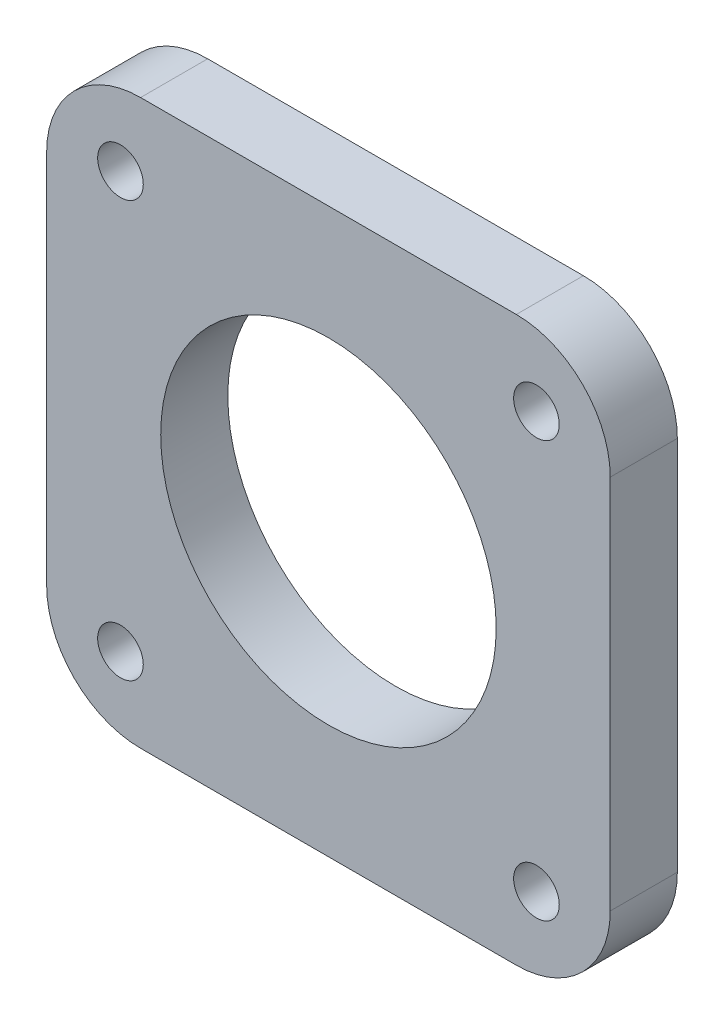
ISO-10303-21;
HEADER;
FILE_DESCRIPTION(('STEP AP214'),'2;1');
FILE_NAME('part.step','',(''),(''),'','','');
FILE_SCHEMA(('AUTOMOTIVE_DESIGN { 1 0 10303 214 1 1 1 1 }'));
ENDSEC;
DATA;
#1=APPLICATION_CONTEXT('core data for automotive mechanical design processes');
#2=APPLICATION_PROTOCOL_DEFINITION('international standard','automotive_design',2000,#1);
#3=PRODUCT_CONTEXT('',#1,'mechanical');
#4=PRODUCT('Part','Part','',(#3));
#5=PRODUCT_RELATED_PRODUCT_CATEGORY('part','',(#4));
#6=PRODUCT_DEFINITION_FORMATION('','',#4);
#7=PRODUCT_DEFINITION_CONTEXT('part definition',#1,'design');
#8=PRODUCT_DEFINITION('design','',#6,#7);
#9=PRODUCT_DEFINITION_SHAPE('','',#8);
#10=(LENGTH_UNIT() NAMED_UNIT(*) SI_UNIT(.MILLI.,.METRE.));
#11=(NAMED_UNIT(*) PLANE_ANGLE_UNIT() SI_UNIT($,.RADIAN.));
#12=(NAMED_UNIT(*) SI_UNIT($,.STERADIAN.) SOLID_ANGLE_UNIT());
#13=UNCERTAINTY_MEASURE_WITH_UNIT(LENGTH_MEASURE(1.E-05),#10,'distance_accuracy_value','');
#14=(GEOMETRIC_REPRESENTATION_CONTEXT(3) GLOBAL_UNCERTAINTY_ASSIGNED_CONTEXT((#13)) GLOBAL_UNIT_ASSIGNED_CONTEXT((#10,
#11,#12)) REPRESENTATION_CONTEXT('',''));
#15=CARTESIAN_POINT('',(0.,0.,0.));
#16=DIRECTION('',(0.,0.,1.));
#17=DIRECTION('',(1.,0.,0.));
#18=AXIS2_PLACEMENT_3D('',#15,#16,#17);
#19=CARTESIAN_POINT('',(0.,0.,5.));
#20=DIRECTION('',(0.,0.,-1.));
#21=DIRECTION('',(-1.,0.,0.));
#22=AXIS2_PLACEMENT_3D('',#19,#20,#21);
#23=PLANE('',#22);
#24=DIRECTION('',(-1.,0.,0.));
#25=VECTOR('',#24,1.);
#26=CARTESIAN_POINT('',(-21.,21.,5.));
#27=LINE('',#26,#25);
#28=CARTESIAN_POINT('',(14.,21.,5.));
#29=VERTEX_POINT('',#28);
#30=CARTESIAN_POINT('',(-14.,21.,5.));
#31=VERTEX_POINT('',#30);
#32=EDGE_CURVE('E177',#29,#31,#27,.T.);
#33=ORIENTED_EDGE('',*,*,#32,.T.);
#34=CARTESIAN_POINT('',(-14.,14.,5.));
#35=DIRECTION('',(0.,0.,-1.));
#36=DIRECTION('',(-1.,0.,0.));
#37=AXIS2_PLACEMENT_3D('',#34,#35,#36);
#38=CIRCLE('',#37,7.);
#39=CARTESIAN_POINT('',(-21.,14.,5.));
#40=VERTEX_POINT('',#39);
#41=EDGE_CURVE('E155',#31,#40,#38,.F.);
#42=ORIENTED_EDGE('',*,*,#41,.T.);
#43=DIRECTION('',(0.,-1.,0.));
#44=VECTOR('',#43,1.);
#45=CARTESIAN_POINT('',(-21.,-21.,5.));
#46=LINE('',#45,#44);
#47=CARTESIAN_POINT('',(-21.,-14.,5.));
#48=VERTEX_POINT('',#47);
#49=EDGE_CURVE('E125',#40,#48,#46,.T.);
#50=ORIENTED_EDGE('',*,*,#49,.T.);
#51=CARTESIAN_POINT('',(-14.,-14.,5.));
#52=DIRECTION('',(0.,0.,-1.));
#53=DIRECTION('',(-1.,0.,0.));
#54=AXIS2_PLACEMENT_3D('',#51,#52,#53);
#55=CIRCLE('',#54,7.);
#56=CARTESIAN_POINT('',(-14.,-21.,5.));
#57=VERTEX_POINT('',#56);
#58=EDGE_CURVE('E61',#48,#57,#55,.F.);
#59=ORIENTED_EDGE('',*,*,#58,.T.);
#60=DIRECTION('',(1.,0.,0.));
#61=VECTOR('',#60,1.);
#62=CARTESIAN_POINT('',(-21.,-21.,5.));
#63=LINE('',#62,#61);
#64=CARTESIAN_POINT('',(14.,-21.,5.));
#65=VERTEX_POINT('',#64);
#66=EDGE_CURVE('E141',#57,#65,#63,.T.);
#67=ORIENTED_EDGE('',*,*,#66,.T.);
#68=CARTESIAN_POINT('',(14.,-14.,5.));
#69=DIRECTION('',(0.,0.,-1.));
#70=DIRECTION('',(-1.,0.,0.));
#71=AXIS2_PLACEMENT_3D('',#68,#69,#70);
#72=CIRCLE('',#71,7.);
#73=CARTESIAN_POINT('',(21.,-14.,5.));
#74=VERTEX_POINT('',#73);
#75=EDGE_CURVE('E151',#65,#74,#72,.F.);
#76=ORIENTED_EDGE('',*,*,#75,.T.);
#77=DIRECTION('',(0.,1.,0.));
#78=VECTOR('',#77,1.);
#79=CARTESIAN_POINT('',(21.,-21.,5.));
#80=LINE('',#79,#78);
#81=CARTESIAN_POINT('',(21.,14.,5.));
#82=VERTEX_POINT('',#81);
#83=EDGE_CURVE('E135',#74,#82,#80,.T.);
#84=ORIENTED_EDGE('',*,*,#83,.T.);
#85=CARTESIAN_POINT('',(14.,14.,5.));
#86=DIRECTION('',(0.,0.,-1.));
#87=DIRECTION('',(-1.,0.,0.));
#88=AXIS2_PLACEMENT_3D('',#85,#86,#87);
#89=CIRCLE('',#88,7.);
#90=EDGE_CURVE('E153',#82,#29,#89,.F.);
#91=ORIENTED_EDGE('',*,*,#90,.T.);
#92=EDGE_LOOP('',(#33,#42,#50,#59,#67,#76,#84,#91));
#93=FACE_BOUND('',#92,.T.);
#94=CARTESIAN_POINT('',(0.,0.,5.));
#95=DIRECTION('',(0.,0.,1.));
#96=DIRECTION('',(1.,0.,0.));
#97=AXIS2_PLACEMENT_3D('',#94,#95,#96);
#98=CIRCLE('',#97,12.5);
#99=CARTESIAN_POINT('',(12.5,0.,5.));
#100=VERTEX_POINT('',#99);
#101=EDGE_CURVE('E186',#100,#100,#98,.T.);
#102=ORIENTED_EDGE('',*,*,#101,.F.);
#103=EDGE_LOOP('',(#102));
#104=FACE_BOUND('',#103,.T.);
#105=CARTESIAN_POINT('',(-15.4999999999999,-15.4999999999991,5.));
#106=DIRECTION('',(0.,0.,1.));
#107=DIRECTION('',(1.,0.,0.));
#108=AXIS2_PLACEMENT_3D('',#105,#106,#107);
#109=CIRCLE('',#108,1.7);
#110=CARTESIAN_POINT('',(-13.7999999999999,-15.4999999999991,5.));
#111=VERTEX_POINT('',#110);
#112=EDGE_CURVE('E191',#111,#111,#109,.T.);
#113=ORIENTED_EDGE('',*,*,#112,.F.);
#114=EDGE_LOOP('',(#113));
#115=FACE_BOUND('',#114,.T.);
#116=CARTESIAN_POINT('',(15.5000000000001,-15.4999999999999,5.));
#117=DIRECTION('',(0.,0.,1.));
#118=DIRECTION('',(1.,0.,0.));
#119=AXIS2_PLACEMENT_3D('',#116,#117,#118);
#120=CIRCLE('',#119,1.7);
#121=CARTESIAN_POINT('',(17.2000000000001,-15.4999999999999,5.));
#122=VERTEX_POINT('',#121);
#123=EDGE_CURVE('E196',#122,#122,#120,.T.);
#124=ORIENTED_EDGE('',*,*,#123,.F.);
#125=EDGE_LOOP('',(#124));
#126=FACE_BOUND('',#125,.T.);
#127=CARTESIAN_POINT('',(15.4999999999999,15.5000000000001,5.));
#128=DIRECTION('',(0.,0.,1.));
#129=DIRECTION('',(1.,0.,0.));
#130=AXIS2_PLACEMENT_3D('',#127,#128,#129);
#131=CIRCLE('',#130,1.7);
#132=CARTESIAN_POINT('',(17.1999999999999,15.5000000000001,5.));
#133=VERTEX_POINT('',#132);
#134=EDGE_CURVE('E202',#133,#133,#131,.T.);
#135=ORIENTED_EDGE('',*,*,#134,.F.);
#136=EDGE_LOOP('',(#135));
#137=FACE_BOUND('',#136,.T.);
#138=CARTESIAN_POINT('',(-15.5000000000001,15.5000000000009,5.));
#139=DIRECTION('',(0.,0.,1.));
#140=DIRECTION('',(1.,0.,0.));
#141=AXIS2_PLACEMENT_3D('',#138,#139,#140);
#142=CIRCLE('',#141,1.7);
#143=CARTESIAN_POINT('',(-13.8000000000001,15.5000000000009,5.));
#144=VERTEX_POINT('',#143);
#145=EDGE_CURVE('E208',#144,#144,#142,.T.);
#146=ORIENTED_EDGE('',*,*,#145,.F.);
#147=EDGE_LOOP('',(#146));
#148=FACE_BOUND('',#147,.T.);
#149=ADVANCED_FACE('F41',(#93,#104,#115,#126,#137,#148),#23,.F.);
#150=CARTESIAN_POINT('',(0.,0.,0.));
#151=DIRECTION('',(0.,0.,-1.));
#152=DIRECTION('',(-1.,0.,0.));
#153=AXIS2_PLACEMENT_3D('',#150,#151,#152);
#154=PLANE('',#153);
#155=CARTESIAN_POINT('',(15.4999999999999,15.5000000000001,0.));
#156=DIRECTION('',(0.,0.,1.));
#157=DIRECTION('',(1.,0.,0.));
#158=AXIS2_PLACEMENT_3D('',#155,#156,#157);
#159=CIRCLE('',#158,1.7);
#160=CARTESIAN_POINT('',(17.1999999999999,15.5000000000001,0.));
#161=VERTEX_POINT('',#160);
#162=EDGE_CURVE('E205',#161,#161,#159,.T.);
#163=ORIENTED_EDGE('',*,*,#162,.T.);
#164=EDGE_LOOP('',(#163));
#165=FACE_BOUND('',#164,.T.);
#166=CARTESIAN_POINT('',(-15.4999999999999,-15.4999999999991,0.));
#167=DIRECTION('',(0.,0.,1.));
#168=DIRECTION('',(1.,0.,0.));
#169=AXIS2_PLACEMENT_3D('',#166,#167,#168);
#170=CIRCLE('',#169,1.7);
#171=CARTESIAN_POINT('',(-13.7999999999999,-15.4999999999991,0.));
#172=VERTEX_POINT('',#171);
#173=EDGE_CURVE('E193',#172,#172,#170,.T.);
#174=ORIENTED_EDGE('',*,*,#173,.T.);
#175=EDGE_LOOP('',(#174));
#176=FACE_BOUND('',#175,.T.);
#177=DIRECTION('',(0.,-1.,0.));
#178=VECTOR('',#177,1.);
#179=CARTESIAN_POINT('',(-21.,-21.,0.));
#180=LINE('',#179,#178);
#181=CARTESIAN_POINT('',(-21.,14.,0.));
#182=VERTEX_POINT('',#181);
#183=CARTESIAN_POINT('',(-21.,-14.,0.));
#184=VERTEX_POINT('',#183);
#185=EDGE_CURVE('E123',#182,#184,#180,.T.);
#186=ORIENTED_EDGE('',*,*,#185,.F.);
#187=CARTESIAN_POINT('',(-14.,14.,0.));
#188=DIRECTION('',(0.,0.,-1.));
#189=DIRECTION('',(-1.,0.,0.));
#190=AXIS2_PLACEMENT_3D('',#187,#188,#189);
#191=CIRCLE('',#190,7.);
#192=CARTESIAN_POINT('',(-14.,21.,0.));
#193=VERTEX_POINT('',#192);
#194=EDGE_CURVE('E106',#182,#193,#191,.T.);
#195=ORIENTED_EDGE('',*,*,#194,.T.);
#196=DIRECTION('',(-1.,0.,0.));
#197=VECTOR('',#196,1.);
#198=CARTESIAN_POINT('',(-21.,21.,0.));
#199=LINE('',#198,#197);
#200=CARTESIAN_POINT('',(14.,21.,0.));
#201=VERTEX_POINT('',#200);
#202=EDGE_CURVE('E133',#201,#193,#199,.T.);
#203=ORIENTED_EDGE('',*,*,#202,.F.);
#204=CARTESIAN_POINT('',(14.,14.,0.));
#205=DIRECTION('',(0.,0.,-1.));
#206=DIRECTION('',(-1.,0.,0.));
#207=AXIS2_PLACEMENT_3D('',#204,#205,#206);
#208=CIRCLE('',#207,7.);
#209=CARTESIAN_POINT('',(21.,14.,0.));
#210=VERTEX_POINT('',#209);
#211=EDGE_CURVE('E117',#201,#210,#208,.T.);
#212=ORIENTED_EDGE('',*,*,#211,.T.);
#213=DIRECTION('',(0.,1.,0.));
#214=VECTOR('',#213,1.);
#215=CARTESIAN_POINT('',(21.,-21.,0.));
#216=LINE('',#215,#214);
#217=CARTESIAN_POINT('',(21.,-14.,0.));
#218=VERTEX_POINT('',#217);
#219=EDGE_CURVE('E137',#218,#210,#216,.T.);
#220=ORIENTED_EDGE('',*,*,#219,.F.);
#221=CARTESIAN_POINT('',(14.,-14.,0.));
#222=DIRECTION('',(0.,0.,-1.));
#223=DIRECTION('',(-1.,0.,0.));
#224=AXIS2_PLACEMENT_3D('',#221,#222,#223);
#225=CIRCLE('',#224,7.);
#226=CARTESIAN_POINT('',(14.,-21.,0.));
#227=VERTEX_POINT('',#226);
#228=EDGE_CURVE('E144',#218,#227,#225,.T.);
#229=ORIENTED_EDGE('',*,*,#228,.T.);
#230=DIRECTION('',(1.,0.,0.));
#231=VECTOR('',#230,1.);
#232=CARTESIAN_POINT('',(-21.,-21.,0.));
#233=LINE('',#232,#231);
#234=CARTESIAN_POINT('',(-14.,-21.,0.));
#235=VERTEX_POINT('',#234);
#236=EDGE_CURVE('E132',#235,#227,#233,.T.);
#237=ORIENTED_EDGE('',*,*,#236,.F.);
#238=CARTESIAN_POINT('',(-14.,-14.,0.));
#239=DIRECTION('',(0.,0.,-1.));
#240=DIRECTION('',(-1.,0.,0.));
#241=AXIS2_PLACEMENT_3D('',#238,#239,#240);
#242=CIRCLE('',#241,7.);
#243=EDGE_CURVE('E126',#235,#184,#242,.T.);
#244=ORIENTED_EDGE('',*,*,#243,.T.);
#245=EDGE_LOOP('',(#186,#195,#203,#212,#220,#229,#237,#244));
#246=FACE_BOUND('',#245,.T.);
#247=CARTESIAN_POINT('',(0.,0.,0.));
#248=DIRECTION('',(0.,0.,1.));
#249=DIRECTION('',(1.,0.,0.));
#250=AXIS2_PLACEMENT_3D('',#247,#248,#249);
#251=CIRCLE('',#250,12.5);
#252=CARTESIAN_POINT('',(12.5,0.,0.));
#253=VERTEX_POINT('',#252);
#254=EDGE_CURVE('E182',#253,#253,#251,.T.);
#255=ORIENTED_EDGE('',*,*,#254,.T.);
#256=EDGE_LOOP('',(#255));
#257=FACE_BOUND('',#256,.T.);
#258=CARTESIAN_POINT('',(15.5000000000001,-15.4999999999999,0.));
#259=DIRECTION('',(0.,0.,1.));
#260=DIRECTION('',(1.,0.,0.));
#261=AXIS2_PLACEMENT_3D('',#258,#259,#260);
#262=CIRCLE('',#261,1.7);
#263=CARTESIAN_POINT('',(17.2000000000001,-15.4999999999999,0.));
#264=VERTEX_POINT('',#263);
#265=EDGE_CURVE('E199',#264,#264,#262,.T.);
#266=ORIENTED_EDGE('',*,*,#265,.T.);
#267=EDGE_LOOP('',(#266));
#268=FACE_BOUND('',#267,.T.);
#269=CARTESIAN_POINT('',(-15.5000000000001,15.5000000000009,0.));
#270=DIRECTION('',(0.,0.,1.));
#271=DIRECTION('',(1.,0.,0.));
#272=AXIS2_PLACEMENT_3D('',#269,#270,#271);
#273=CIRCLE('',#272,1.7);
#274=CARTESIAN_POINT('',(-13.8000000000001,15.5000000000009,0.));
#275=VERTEX_POINT('',#274);
#276=EDGE_CURVE('E211',#275,#275,#273,.T.);
#277=ORIENTED_EDGE('',*,*,#276,.T.);
#278=EDGE_LOOP('',(#277));
#279=FACE_BOUND('',#278,.T.);
#280=ADVANCED_FACE('F129',(#165,#176,#246,#257,#268,#279),#154,.T.);
#281=CARTESIAN_POINT('',(21.,-21.,5.));
#282=DIRECTION('',(-1.,0.,0.));
#283=DIRECTION('',(0.,0.,1.));
#284=AXIS2_PLACEMENT_3D('',#281,#282,#283);
#285=PLANE('',#284);
#286=ORIENTED_EDGE('',*,*,#219,.T.);
#287=DIRECTION('',(0.,0.,-1.));
#288=VECTOR('',#287,1.);
#289=CARTESIAN_POINT('',(21.,14.,5.));
#290=LINE('',#289,#288);
#291=EDGE_CURVE('E160',#210,#82,#290,.F.);
#292=ORIENTED_EDGE('',*,*,#291,.T.);
#293=ORIENTED_EDGE('',*,*,#83,.F.);
#294=DIRECTION('',(0.,0.,-1.));
#295=VECTOR('',#294,1.);
#296=CARTESIAN_POINT('',(21.,-14.,5.));
#297=LINE('',#296,#295);
#298=EDGE_CURVE('E157',#74,#218,#297,.T.);
#299=ORIENTED_EDGE('',*,*,#298,.T.);
#300=EDGE_LOOP('',(#286,#292,#293,#299));
#301=FACE_BOUND('',#300,.T.);
#302=ADVANCED_FACE('F173',(#301),#285,.F.);
#303=CARTESIAN_POINT('',(-21.,21.,5.));
#304=DIRECTION('',(0.,-1.,0.));
#305=DIRECTION('',(0.,0.,-1.));
#306=AXIS2_PLACEMENT_3D('',#303,#304,#305);
#307=PLANE('',#306);
#308=ORIENTED_EDGE('',*,*,#202,.T.);
#309=DIRECTION('',(0.,0.,-1.));
#310=VECTOR('',#309,1.);
#311=CARTESIAN_POINT('',(-14.,21.,5.));
#312=LINE('',#311,#310);
#313=EDGE_CURVE('E111',#193,#31,#312,.F.);
#314=ORIENTED_EDGE('',*,*,#313,.T.);
#315=ORIENTED_EDGE('',*,*,#32,.F.);
#316=DIRECTION('',(0.,0.,-1.));
#317=VECTOR('',#316,1.);
#318=CARTESIAN_POINT('',(14.,21.,5.));
#319=LINE('',#318,#317);
#320=EDGE_CURVE('E116',#29,#201,#319,.T.);
#321=ORIENTED_EDGE('',*,*,#320,.T.);
#322=EDGE_LOOP('',(#308,#314,#315,#321));
#323=FACE_BOUND('',#322,.T.);
#324=ADVANCED_FACE('F237',(#323),#307,.F.);
#325=CARTESIAN_POINT('',(-21.,-21.,5.));
#326=DIRECTION('',(1.,0.,0.));
#327=DIRECTION('',(0.,0.,-1.));
#328=AXIS2_PLACEMENT_3D('',#325,#326,#327);
#329=PLANE('',#328);
#330=ORIENTED_EDGE('',*,*,#49,.F.);
#331=DIRECTION('',(0.,0.,-1.));
#332=VECTOR('',#331,1.);
#333=CARTESIAN_POINT('',(-21.,14.,5.));
#334=LINE('',#333,#332);
#335=EDGE_CURVE('E110',#40,#182,#334,.T.);
#336=ORIENTED_EDGE('',*,*,#335,.T.);
#337=ORIENTED_EDGE('',*,*,#185,.T.);
#338=DIRECTION('',(0.,0.,-1.));
#339=VECTOR('',#338,1.);
#340=CARTESIAN_POINT('',(-21.,-14.,5.));
#341=LINE('',#340,#339);
#342=EDGE_CURVE('E127',#184,#48,#341,.F.);
#343=ORIENTED_EDGE('',*,*,#342,.T.);
#344=EDGE_LOOP('',(#330,#336,#337,#343));
#345=FACE_BOUND('',#344,.T.);
#346=ADVANCED_FACE('F122',(#345),#329,.F.);
#347=CARTESIAN_POINT('',(-21.,-21.,5.));
#348=DIRECTION('',(0.,1.,0.));
#349=DIRECTION('',(0.,0.,1.));
#350=AXIS2_PLACEMENT_3D('',#347,#348,#349);
#351=PLANE('',#350);
#352=ORIENTED_EDGE('',*,*,#236,.T.);
#353=DIRECTION('',(0.,0.,-1.));
#354=VECTOR('',#353,1.);
#355=CARTESIAN_POINT('',(14.,-21.,5.));
#356=LINE('',#355,#354);
#357=EDGE_CURVE('E11',#227,#65,#356,.F.);
#358=ORIENTED_EDGE('',*,*,#357,.T.);
#359=ORIENTED_EDGE('',*,*,#66,.F.);
#360=DIRECTION('',(0.,0.,-1.));
#361=VECTOR('',#360,1.);
#362=CARTESIAN_POINT('',(-14.,-21.,5.));
#363=LINE('',#362,#361);
#364=EDGE_CURVE('E49',#57,#235,#363,.T.);
#365=ORIENTED_EDGE('',*,*,#364,.T.);
#366=EDGE_LOOP('',(#352,#358,#359,#365));
#367=FACE_BOUND('',#366,.T.);
#368=ADVANCED_FACE('F163',(#367),#351,.F.);
#369=CARTESIAN_POINT('',(0.,0.,5.));
#370=DIRECTION('',(0.,0.,-1.));
#371=DIRECTION('',(-1.,0.,0.));
#372=AXIS2_PLACEMENT_3D('',#369,#370,#371);
#373=CYLINDRICAL_SURFACE('',#372,12.5);
#374=ORIENTED_EDGE('',*,*,#101,.T.);
#375=EDGE_LOOP('',(#374));
#376=FACE_BOUND('',#375,.T.);
#377=ORIENTED_EDGE('',*,*,#254,.F.);
#378=EDGE_LOOP('',(#377));
#379=FACE_BOUND('',#378,.T.);
#380=ADVANCED_FACE('F230',(#376,#379),#373,.F.);
#381=CARTESIAN_POINT('',(-15.4999999999999,-15.4999999999991,5.));
#382=DIRECTION('',(0.,0.,-1.));
#383=DIRECTION('',(-1.,0.,0.));
#384=AXIS2_PLACEMENT_3D('',#381,#382,#383);
#385=CYLINDRICAL_SURFACE('',#384,1.7);
#386=ORIENTED_EDGE('',*,*,#112,.T.);
#387=EDGE_LOOP('',(#386));
#388=FACE_BOUND('',#387,.T.);
#389=ORIENTED_EDGE('',*,*,#173,.F.);
#390=EDGE_LOOP('',(#389));
#391=FACE_BOUND('',#390,.T.);
#392=ADVANCED_FACE('F300',(#388,#391),#385,.F.);
#393=CARTESIAN_POINT('',(15.5000000000001,-15.4999999999999,5.));
#394=DIRECTION('',(0.,0.,-1.));
#395=DIRECTION('',(-1.,0.,0.));
#396=AXIS2_PLACEMENT_3D('',#393,#394,#395);
#397=CYLINDRICAL_SURFACE('',#396,1.7);
#398=ORIENTED_EDGE('',*,*,#123,.T.);
#399=EDGE_LOOP('',(#398));
#400=FACE_BOUND('',#399,.T.);
#401=ORIENTED_EDGE('',*,*,#265,.F.);
#402=EDGE_LOOP('',(#401));
#403=FACE_BOUND('',#402,.T.);
#404=ADVANCED_FACE('F290',(#400,#403),#397,.F.);
#405=CARTESIAN_POINT('',(15.4999999999999,15.5000000000001,5.));
#406=DIRECTION('',(0.,0.,-1.));
#407=DIRECTION('',(-1.,0.,0.));
#408=AXIS2_PLACEMENT_3D('',#405,#406,#407);
#409=CYLINDRICAL_SURFACE('',#408,1.7);
#410=ORIENTED_EDGE('',*,*,#134,.T.);
#411=EDGE_LOOP('',(#410));
#412=FACE_BOUND('',#411,.T.);
#413=ORIENTED_EDGE('',*,*,#162,.F.);
#414=EDGE_LOOP('',(#413));
#415=FACE_BOUND('',#414,.T.);
#416=ADVANCED_FACE('F281',(#412,#415),#409,.F.);
#417=CARTESIAN_POINT('',(-15.5000000000001,15.5000000000009,5.));
#418=DIRECTION('',(0.,0.,-1.));
#419=DIRECTION('',(-1.,0.,0.));
#420=AXIS2_PLACEMENT_3D('',#417,#418,#419);
#421=CYLINDRICAL_SURFACE('',#420,1.7);
#422=ORIENTED_EDGE('',*,*,#145,.T.);
#423=EDGE_LOOP('',(#422));
#424=FACE_BOUND('',#423,.T.);
#425=ORIENTED_EDGE('',*,*,#276,.F.);
#426=EDGE_LOOP('',(#425));
#427=FACE_BOUND('',#426,.T.);
#428=ADVANCED_FACE('F217',(#424,#427),#421,.F.);
#429=CARTESIAN_POINT('',(-14.,14.,5.));
#430=DIRECTION('',(0.,0.,-1.));
#431=DIRECTION('',(-1.,0.,0.));
#432=AXIS2_PLACEMENT_3D('',#429,#430,#431);
#433=CYLINDRICAL_SURFACE('',#432,7.);
#434=ORIENTED_EDGE('',*,*,#41,.F.);
#435=ORIENTED_EDGE('',*,*,#313,.F.);
#436=ORIENTED_EDGE('',*,*,#194,.F.);
#437=ORIENTED_EDGE('',*,*,#335,.F.);
#438=EDGE_LOOP('',(#434,#435,#436,#437));
#439=FACE_BOUND('',#438,.T.);
#440=ADVANCED_FACE('F109',(#439),#433,.T.);
#441=CARTESIAN_POINT('',(14.,14.,5.));
#442=DIRECTION('',(0.,0.,-1.));
#443=DIRECTION('',(-1.,0.,0.));
#444=AXIS2_PLACEMENT_3D('',#441,#442,#443);
#445=CYLINDRICAL_SURFACE('',#444,7.);
#446=ORIENTED_EDGE('',*,*,#90,.F.);
#447=ORIENTED_EDGE('',*,*,#291,.F.);
#448=ORIENTED_EDGE('',*,*,#211,.F.);
#449=ORIENTED_EDGE('',*,*,#320,.F.);
#450=EDGE_LOOP('',(#446,#447,#448,#449));
#451=FACE_BOUND('',#450,.T.);
#452=ADVANCED_FACE('F245',(#451),#445,.T.);
#453=CARTESIAN_POINT('',(14.,-14.,5.));
#454=DIRECTION('',(0.,0.,-1.));
#455=DIRECTION('',(-1.,0.,0.));
#456=AXIS2_PLACEMENT_3D('',#453,#454,#455);
#457=CYLINDRICAL_SURFACE('',#456,7.);
#458=ORIENTED_EDGE('',*,*,#75,.F.);
#459=ORIENTED_EDGE('',*,*,#357,.F.);
#460=ORIENTED_EDGE('',*,*,#228,.F.);
#461=ORIENTED_EDGE('',*,*,#298,.F.);
#462=EDGE_LOOP('',(#458,#459,#460,#461));
#463=FACE_BOUND('',#462,.T.);
#464=ADVANCED_FACE('F170',(#463),#457,.T.);
#465=CARTESIAN_POINT('',(-14.,-14.,5.));
#466=DIRECTION('',(0.,0.,-1.));
#467=DIRECTION('',(-1.,0.,0.));
#468=AXIS2_PLACEMENT_3D('',#465,#466,#467);
#469=CYLINDRICAL_SURFACE('',#468,7.);
#470=ORIENTED_EDGE('',*,*,#58,.F.);
#471=ORIENTED_EDGE('',*,*,#342,.F.);
#472=ORIENTED_EDGE('',*,*,#243,.F.);
#473=ORIENTED_EDGE('',*,*,#364,.F.);
#474=EDGE_LOOP('',(#470,#471,#472,#473));
#475=FACE_BOUND('',#474,.T.);
#476=ADVANCED_FACE('F43',(#475),#469,.T.);
#477=CLOSED_SHELL('',(#149,#280,#302,#324,#346,#368,#380,#392,#404,#416,#428,#440,#452,#464,#476));
#478=MANIFOLD_SOLID_BREP('B2',#477);
#479=ADVANCED_BREP_SHAPE_REPRESENTATION('',(#18,#478),#14);
#480=SHAPE_DEFINITION_REPRESENTATION(#9,#479);
ENDSEC;
END-ISO-10303-21;
